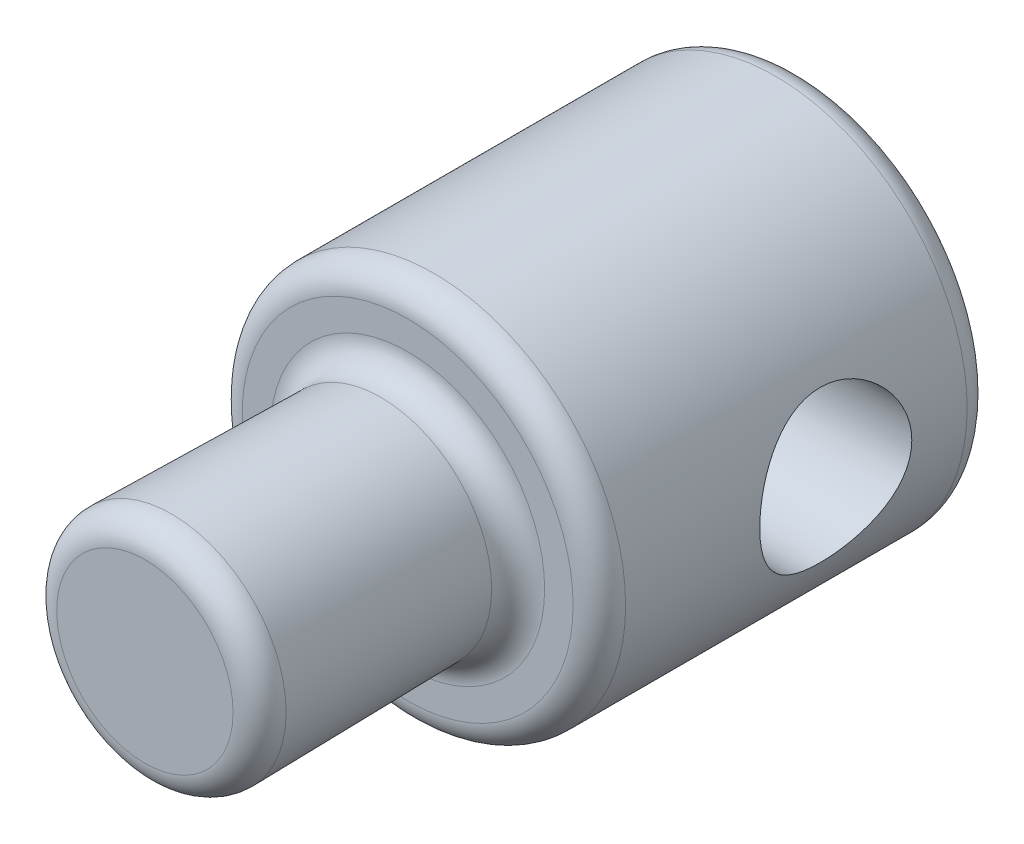
ISO-10303-21;
HEADER;
FILE_DESCRIPTION(('STEP AP214'),'2;1');
FILE_NAME('part.step','',(''),(''),'','','');
FILE_SCHEMA(('AUTOMOTIVE_DESIGN { 1 0 10303 214 1 1 1 1 }'));
ENDSEC;
DATA;
#1=APPLICATION_CONTEXT('core data for automotive mechanical design processes');
#2=APPLICATION_PROTOCOL_DEFINITION('international standard','automotive_design',2000,#1);
#3=PRODUCT_CONTEXT('',#1,'mechanical');
#4=PRODUCT('Part','Part','',(#3));
#5=PRODUCT_RELATED_PRODUCT_CATEGORY('part','',(#4));
#6=PRODUCT_DEFINITION_FORMATION('','',#4);
#7=PRODUCT_DEFINITION_CONTEXT('part definition',#1,'design');
#8=PRODUCT_DEFINITION('design','',#6,#7);
#9=PRODUCT_DEFINITION_SHAPE('','',#8);
#10=(LENGTH_UNIT() NAMED_UNIT(*) SI_UNIT(.MILLI.,.METRE.));
#11=(NAMED_UNIT(*) PLANE_ANGLE_UNIT() SI_UNIT($,.RADIAN.));
#12=(NAMED_UNIT(*) SI_UNIT($,.STERADIAN.) SOLID_ANGLE_UNIT());
#13=UNCERTAINTY_MEASURE_WITH_UNIT(LENGTH_MEASURE(1.E-05),#10,'distance_accuracy_value','');
#14=(GEOMETRIC_REPRESENTATION_CONTEXT(3) GLOBAL_UNCERTAINTY_ASSIGNED_CONTEXT((#13)) GLOBAL_UNIT_ASSIGNED_CONTEXT((#10,
#11,#12)) REPRESENTATION_CONTEXT('',''));
#15=CARTESIAN_POINT('',(0.,0.,0.));
#16=DIRECTION('',(0.,0.,1.));
#17=DIRECTION('',(1.,0.,0.));
#18=AXIS2_PLACEMENT_3D('',#15,#16,#17);
#19=CARTESIAN_POINT('',(0.,0.,7.5));
#20=DIRECTION('',(0.,0.,-1.));
#21=DIRECTION('',(-1.,0.,0.));
#22=AXIS2_PLACEMENT_3D('',#19,#20,#21);
#23=CYLINDRICAL_SURFACE('',#22,3.65);
#24=CARTESIAN_POINT('',(0.,0.,7.));
#25=DIRECTION('',(0.,0.,1.));
#26=DIRECTION('',(1.,0.,0.));
#27=AXIS2_PLACEMENT_3D('',#24,#25,#26);
#28=CIRCLE('',#27,3.65);
#29=CARTESIAN_POINT('',(3.65,0.,7.));
#30=VERTEX_POINT('',#29);
#31=EDGE_CURVE('E38',#30,#30,#28,.F.);
#32=ORIENTED_EDGE('',*,*,#31,.T.);
#33=EDGE_LOOP('',(#32));
#34=FACE_BOUND('',#33,.T.);
#35=CARTESIAN_POINT('',(0.,0.,0.5));
#36=DIRECTION('',(0.,0.,1.));
#37=DIRECTION('',(1.,0.,0.));
#38=AXIS2_PLACEMENT_3D('',#35,#36,#37);
#39=CIRCLE('',#38,3.65);
#40=CARTESIAN_POINT('',(3.65,0.,0.5));
#41=VERTEX_POINT('',#40);
#42=EDGE_CURVE('E42',#41,#41,#39,.T.);
#43=ORIENTED_EDGE('',*,*,#42,.T.);
#44=EDGE_LOOP('',(#43));
#45=FACE_BOUND('',#44,.T.);
#46=CARTESIAN_POINT('',(3.4907572028848,-1.06635554601099,2.02402985433312));
#47=CARTESIAN_POINT('',(3.47433340094243,-1.12011519832144,2.08298672949501));
#48=CARTESIAN_POINT('',(3.45801481899643,-1.16907814235958,2.14649641845138));
#49=CARTESIAN_POINT('',(3.42736564701972,-1.25610966903779,2.28119910217456));
#50=CARTESIAN_POINT('',(3.41303983698565,-1.29415228203152,2.35240986669365));
#51=CARTESIAN_POINT('',(3.38809444987374,-1.3581245585864,2.50091867779882));
#52=CARTESIAN_POINT('',(3.37748284665533,-1.38402820143571,2.57822938961605));
#53=CARTESIAN_POINT('',(3.36145110379116,-1.42253004445101,2.73655382971091));
#54=CARTESIAN_POINT('',(3.35602513933751,-1.43514317492284,2.81756329586792));
#55=CARTESIAN_POINT('',(3.35126796373,-1.44621407364177,2.97629185782361));
#56=CARTESIAN_POINT('',(3.3516220465919,-1.44540272934181,3.05395100576178));
#57=CARTESIAN_POINT('',(3.35761010164857,-1.43143650507849,3.20794518528418));
#58=CARTESIAN_POINT('',(3.36324457497591,-1.41828045354731,3.28428009049153));
#59=CARTESIAN_POINT('',(3.37885151826692,-1.38067309658902,3.43148064217386));
#60=CARTESIAN_POINT('',(3.38870740535699,-1.3565243251867,3.50243688246354));
#61=CARTESIAN_POINT('',(3.41160962506218,-1.29784721706682,3.63935923529652));
#62=CARTESIAN_POINT('',(3.42465679648061,-1.26331615089902,3.70532402990027));
#63=CARTESIAN_POINT('',(3.45348076853554,-1.18233913667038,3.83483941125098));
#64=CARTESIAN_POINT('',(3.46937709682455,-1.13528414638599,3.89798248736134));
#65=CARTESIAN_POINT('',(3.5015971256315,-1.03163033924307,4.01577749265487));
#66=CARTESIAN_POINT('',(3.51792098782301,-0.975027866631622,4.07042615384704));
#67=CARTESIAN_POINT('',(3.55022574819579,-0.850160544871231,4.17269777058331));
#68=CARTESIAN_POINT('',(3.56613901421401,-0.781427047463141,4.21977272570799));
#69=CARTESIAN_POINT('',(3.5948529394211,-0.636386143793492,4.3016142490277));
#70=CARTESIAN_POINT('',(3.60765435953009,-0.560080595517381,4.33638382712914));
#71=CARTESIAN_POINT('',(3.628339227933,-0.404493550753085,4.39143166620309));
#72=CARTESIAN_POINT('',(3.63636413363276,-0.325380082134694,4.41212964036373));
#73=CARTESIAN_POINT('',(3.64718311073424,-0.164456167353328,4.43985838466148));
#74=CARTESIAN_POINT('',(3.64997966558103,-0.0826470204280999,4.44689564364283));
#75=CARTESIAN_POINT('',(3.65001884385056,0.0757224128803292,4.44699187306782));
#76=CARTESIAN_POINT('',(3.64760534112423,0.152283659729818,4.44091631961156));
#77=CARTESIAN_POINT('',(3.63817139211249,0.303191250501697,4.41678038401657));
#78=CARTESIAN_POINT('',(3.63115098646814,0.377537613957238,4.39872010760433));
#79=CARTESIAN_POINT('',(3.61325258208363,0.521693714219351,4.35140378758723));
#80=CARTESIAN_POINT('',(3.60239165945356,0.591521939930665,4.32219725877983));
#81=CARTESIAN_POINT('',(3.57784177966545,0.72538647127878,4.25351822450502));
#82=CARTESIAN_POINT('',(3.56415205977742,0.78942120810496,4.21404294952586));
#83=CARTESIAN_POINT('',(3.5343289243536,0.91398174932301,4.1232351588767));
#84=CARTESIAN_POINT('',(3.51809855434694,0.974071805197713,4.07133671732291));
#85=CARTESIAN_POINT('',(3.48549544344382,1.08497436234468,3.95843434733939));
#86=CARTESIAN_POINT('',(3.46912264542195,1.13578294248014,3.89742659019474));
#87=CARTESIAN_POINT('',(3.43722516324893,1.22903531133008,3.76461519035351));
#88=CARTESIAN_POINT('',(3.42177529278563,1.27098041823795,3.6924415085164));
#89=CARTESIAN_POINT('',(3.39453948244694,1.3420356322372,3.54139017282783));
#90=CARTESIAN_POINT('',(3.38275205122531,1.37115096564101,3.46251526442285));
#91=CARTESIAN_POINT('',(3.3648485185758,1.41450640095995,3.30354776652904));
#92=CARTESIAN_POINT('',(3.35852574383977,1.42929142534295,3.22362799026034));
#93=CARTESIAN_POINT('',(3.35168003316212,1.44527609410235,3.06221159503834));
#94=CARTESIAN_POINT('',(3.35115420826222,1.44648250550002,2.98071578180404));
#95=CARTESIAN_POINT('',(3.35580233491057,1.43565824922411,2.8244165377329));
#96=CARTESIAN_POINT('',(3.36058873045905,1.42452770514062,2.74953675092833));
#97=CARTESIAN_POINT('',(3.37464253547267,1.39090473253634,2.60281775034706));
#98=CARTESIAN_POINT('',(3.3839106505487,1.36841051487109,2.53097901729753));
#99=CARTESIAN_POINT('',(3.40603026037464,1.3123920622994,2.39098460006442));
#100=CARTESIAN_POINT('',(3.41893691726632,1.27869647603227,2.32290660098599));
#101=CARTESIAN_POINT('',(3.44687762922807,1.20134195324479,2.19314608898578));
#102=CARTESIAN_POINT('',(3.46191245319014,1.15767941222431,2.1314659015667));
#103=CARTESIAN_POINT('',(3.49377637338656,1.0578129075108,2.01142636629943));
#104=CARTESIAN_POINT('',(3.51065581975265,1.00091864205516,1.95365325742299));
#105=CARTESIAN_POINT('',(3.54337193594542,0.878095040812412,1.84828064760304));
#106=CARTESIAN_POINT('',(3.55920839128246,0.812163855131736,1.80068323478471));
#107=CARTESIAN_POINT('',(3.58846309248547,0.671343538370003,1.71614893974568));
#108=CARTESIAN_POINT('',(3.60182484678852,0.596297941445842,1.67945168240272));
#109=CARTESIAN_POINT('',(3.62418309828771,0.440432106778736,1.61942629405831));
#110=CARTESIAN_POINT('',(3.63318168990785,0.359614661081171,1.59609174765539));
#111=CARTESIAN_POINT('',(3.64537493391949,0.199524047084137,1.56473397574841));
#112=CARTESIAN_POINT('',(3.64887556384869,0.120432556610964,1.55590219640449));
#113=CARTESIAN_POINT('',(3.65066086466114,-0.0381651024981441,1.55138024231981));
#114=CARTESIAN_POINT('',(3.64894756476715,-0.117671097788068,1.55568495495574));
#115=CARTESIAN_POINT('',(3.64070139341126,-0.270955315364573,1.57672616608268));
#116=CARTESIAN_POINT('',(3.63439642265662,-0.3448279384368,1.59287505689879));
#117=CARTESIAN_POINT('',(3.61785038715681,-0.488788409308138,1.63633476346819));
#118=CARTESIAN_POINT('',(3.60760663317729,-0.55887363386224,1.66365320612742));
#119=CARTESIAN_POINT('',(3.58381253742255,-0.69551652910994,1.72950325437396));
#120=CARTESIAN_POINT('',(3.57017433937684,-0.761911330426762,1.76833912696888));
#121=CARTESIAN_POINT('',(3.54108082177924,-0.887346095295939,1.85573461403239));
#122=CARTESIAN_POINT('',(3.52562919015779,-0.946400499666926,1.90427463024126));
#123=CARTESIAN_POINT('',(3.50360186690154,-1.0236322998338,1.97867313504468));
#124=CARTESIAN_POINT('',(3.49717151034782,-1.04535974124945,2.00100427684051));
#125=CARTESIAN_POINT('',(3.4907572028848,-1.06635554601099,2.02402985433312));
#126=B_SPLINE_CURVE_WITH_KNOTS('',3,(#46,#47,#48,#49,#50,#51,#52,#53,#54,#55,#56,#57,#58,#59,
#60,#61,#62,#63,#64,#65,#66,#67,#68,#69,#70,#71,#72,#73,#74,#75,#76,#77,#78,#79,#80,#81,#82,#83,
#84,#85,#86,#87,#88,#89,#90,#91,#92,#93,#94,#95,#96,#97,#98,#99,#100,#101,#102,#103,#104,#105,
#106,#107,#108,#109,#110,#111,#112,#113,#114,#115,#116,#117,#118,#119,#120,#121,#122,#123,#124,
#125),.UNSPECIFIED.,.T.,.F.,(4,2,2,2,2,2,2,2,2,2,2,2,2,2,2,2,2,2,2,2,2,2,2,2,2,2,2,2,2,2,2,2,2,
2,2,2,2,2,2,4),(0.,0.244295087722937,0.489166409913373,0.734560256253544,0.979678137008933,
1.21149683372462,1.44333753329473,1.66915107270126,1.89502402927471,2.13499173387641,
2.37505153211667,2.62824593515989,2.88137836374941,3.12658366959702,3.37167247431544,
3.60108140062012,3.83048830315838,4.05888775945547,4.28734887975539,4.52940893878002,
4.77157102538765,5.02499102477413,5.27830769581731,5.52156236844414,5.76469580759367,
5.99119237898028,6.21772462205673,6.4478952163218,6.67814918289523,6.92549249294211,
7.1728865109786,7.42537330781033,7.67773878456682,7.91548718981428,8.15314307698308,
8.37974385819829,8.60649962833985,8.83987986050041,9.07279344009862,9.16820276187801),.UNSPECIFIED.);
#127=CARTESIAN_POINT('',(3.4907572028848,-1.06635554601099,2.02402985433312));
#128=VERTEX_POINT('',#127);
#129=EDGE_CURVE('E63',#128,#128,#126,.T.);
#130=ORIENTED_EDGE('',*,*,#129,.T.);
#131=EDGE_LOOP('',(#130));
#132=FACE_BOUND('',#131,.T.);
#133=ADVANCED_FACE('F31',(#34,#45,#132),#23,.T.);
#134=CARTESIAN_POINT('',(0.,0.,7.5));
#135=DIRECTION('',(0.,0.,1.));
#136=DIRECTION('',(1.,0.,0.));
#137=AXIS2_PLACEMENT_3D('',#134,#135,#136);
#138=PLANE('',#137);
#139=CARTESIAN_POINT('',(0.,0.,7.5));
#140=DIRECTION('',(0.,0.,1.));
#141=DIRECTION('',(1.,0.,0.));
#142=AXIS2_PLACEMENT_3D('',#139,#140,#141);
#143=CIRCLE('',#142,3.15);
#144=CARTESIAN_POINT('',(3.15,0.,7.5));
#145=VERTEX_POINT('',#144);
#146=EDGE_CURVE('E46',#145,#145,#143,.T.);
#147=ORIENTED_EDGE('',*,*,#146,.T.);
#148=EDGE_LOOP('',(#147));
#149=FACE_BOUND('',#148,.T.);
#150=CARTESIAN_POINT('',(0.,0.,7.5));
#151=DIRECTION('',(0.,0.,1.));
#152=DIRECTION('',(1.,0.,0.));
#153=AXIS2_PLACEMENT_3D('',#150,#151,#152);
#154=CIRCLE('',#153,2.60880369648606);
#155=CARTESIAN_POINT('',(2.60880369648606,0.,7.5));
#156=VERTEX_POINT('',#155);
#157=EDGE_CURVE('E51',#156,#156,#154,.F.);
#158=ORIENTED_EDGE('',*,*,#157,.T.);
#159=EDGE_LOOP('',(#158));
#160=FACE_BOUND('',#159,.T.);
#161=ADVANCED_FACE('F83',(#149,#160),#138,.T.);
#162=CARTESIAN_POINT('',(0.,0.,0.));
#163=DIRECTION('',(0.,0.,1.));
#164=DIRECTION('',(1.,0.,0.));
#165=AXIS2_PLACEMENT_3D('',#162,#163,#164);
#166=PLANE('',#165);
#167=CARTESIAN_POINT('',(0.,0.,0.));
#168=DIRECTION('',(0.,0.,1.));
#169=DIRECTION('',(1.,0.,0.));
#170=AXIS2_PLACEMENT_3D('',#167,#168,#169);
#171=CIRCLE('',#170,3.15);
#172=CARTESIAN_POINT('',(3.15,0.,0.));
#173=VERTEX_POINT('',#172);
#174=EDGE_CURVE('E10',#173,#173,#171,.F.);
#175=ORIENTED_EDGE('',*,*,#174,.T.);
#176=EDGE_LOOP('',(#175));
#177=FACE_BOUND('',#176,.T.);
#178=ADVANCED_FACE('F80',(#177),#166,.F.);
#179=CARTESIAN_POINT('',(4.,0.,3.));
#180=DIRECTION('',(1.,0.,0.));
#181=DIRECTION('',(0.,0.,-1.));
#182=AXIS2_PLACEMENT_3D('',#179,#180,#181);
#183=CONICAL_SURFACE('',#182,1.45,0.00872664625997167);
#184=CARTESIAN_POINT('',(-3.2,0.,3.));
#185=DIRECTION('',(1.,0.,0.));
#186=DIRECTION('',(0.,0.,-1.));
#187=AXIS2_PLACEMENT_3D('',#184,#185,#186);
#188=CIRCLE('',#187,1.38716655190654);
#189=CARTESIAN_POINT('',(-3.2,0.,1.61283344809346));
#190=VERTEX_POINT('',#189);
#191=EDGE_CURVE('E70',#190,#190,#188,.T.);
#192=ORIENTED_EDGE('',*,*,#191,.F.);
#193=EDGE_LOOP('',(#192));
#194=FACE_BOUND('',#193,.T.);
#195=ORIENTED_EDGE('',*,*,#129,.F.);
#196=EDGE_LOOP('',(#195));
#197=FACE_BOUND('',#196,.T.);
#198=ADVANCED_FACE('F74',(#194,#197),#183,.F.);
#199=CARTESIAN_POINT('',(-3.2,0.,3.));
#200=DIRECTION('',(1.,0.,0.));
#201=DIRECTION('',(0.,0.,-1.));
#202=AXIS2_PLACEMENT_3D('',#199,#200,#201);
#203=PLANE('',#202);
#204=ORIENTED_EDGE('',*,*,#191,.T.);
#205=EDGE_LOOP('',(#204));
#206=FACE_BOUND('',#205,.T.);
#207=ADVANCED_FACE('F79',(#206),#203,.T.);
#208=CARTESIAN_POINT('',(0.,0.,7.5));
#209=DIRECTION('',(0.,0.,1.));
#210=DIRECTION('',(1.,0.,0.));
#211=AXIS2_PLACEMENT_3D('',#208,#209,#210);
#212=CONICAL_SURFACE('',#211,2.1,0.0174532925199433);
#213=CARTESIAN_POINT('',(0.,0.,11.9912737967814));
#214=DIRECTION('',(0.,0.,1.));
#215=DIRECTION('',(1.,0.,0.));
#216=AXIS2_PLACEMENT_3D('',#213,#214,#215);
#217=CIRCLE('',#216,2.17839547573322);
#218=CARTESIAN_POINT('',(2.17839547573322,0.,11.9912737967814));
#219=VERTEX_POINT('',#218);
#220=EDGE_CURVE('E54',#219,#219,#217,.F.);
#221=ORIENTED_EDGE('',*,*,#220,.T.);
#222=EDGE_LOOP('',(#221));
#223=FACE_BOUND('',#222,.T.);
#224=CARTESIAN_POINT('',(0.,0.,8.00872620321866));
#225=DIRECTION('',(0.,0.,-1.));
#226=DIRECTION('',(-1.,0.,0.));
#227=AXIS2_PLACEMENT_3D('',#224,#225,#226);
#228=CIRCLE('',#227,2.10887984890787);
#229=CARTESIAN_POINT('',(-2.10887984890787,0.,8.00872620321866));
#230=VERTEX_POINT('',#229);
#231=EDGE_CURVE('E57',#230,#230,#228,.F.);
#232=ORIENTED_EDGE('',*,*,#231,.T.);
#233=EDGE_LOOP('',(#232));
#234=FACE_BOUND('',#233,.T.);
#235=ADVANCED_FACE('F116',(#223,#234),#212,.T.);
#236=CARTESIAN_POINT('',(0.,0.,12.5));
#237=DIRECTION('',(0.,0.,1.));
#238=DIRECTION('',(1.,0.,0.));
#239=AXIS2_PLACEMENT_3D('',#236,#237,#238);
#240=PLANE('',#239);
#241=CARTESIAN_POINT('',(0.,0.,12.5));
#242=DIRECTION('',(0.,0.,1.));
#243=DIRECTION('',(1.,0.,0.));
#244=AXIS2_PLACEMENT_3D('',#241,#242,#243);
#245=CIRCLE('',#244,1.67847162815503);
#246=CARTESIAN_POINT('',(1.67847162815503,0.,12.5));
#247=VERTEX_POINT('',#246);
#248=EDGE_CURVE('E60',#247,#247,#245,.T.);
#249=ORIENTED_EDGE('',*,*,#248,.T.);
#250=EDGE_LOOP('',(#249));
#251=FACE_BOUND('',#250,.T.);
#252=ADVANCED_FACE('F111',(#251),#240,.T.);
#253=CARTESIAN_POINT('',(0.,0.,12.));
#254=DIRECTION('',(0.,0.,1.));
#255=DIRECTION('',(1.,0.,0.));
#256=AXIS2_PLACEMENT_3D('',#253,#254,#255);
#257=TOROIDAL_SURFACE('',#256,1.67847162815503,0.5);
#258=ORIENTED_EDGE('',*,*,#220,.F.);
#259=EDGE_LOOP('',(#258));
#260=FACE_BOUND('',#259,.T.);
#261=ORIENTED_EDGE('',*,*,#248,.F.);
#262=EDGE_LOOP('',(#261));
#263=FACE_BOUND('',#262,.T.);
#264=ADVANCED_FACE('F107',(#260,#263),#257,.T.);
#265=CARTESIAN_POINT('',(0.,0.,7.));
#266=DIRECTION('',(0.,0.,1.));
#267=DIRECTION('',(1.,0.,0.));
#268=AXIS2_PLACEMENT_3D('',#265,#266,#267);
#269=TOROIDAL_SURFACE('',#268,3.15,0.5);
#270=ORIENTED_EDGE('',*,*,#31,.F.);
#271=EDGE_LOOP('',(#270));
#272=FACE_BOUND('',#271,.T.);
#273=ORIENTED_EDGE('',*,*,#146,.F.);
#274=EDGE_LOOP('',(#273));
#275=FACE_BOUND('',#274,.T.);
#276=ADVANCED_FACE('F100',(#272,#275),#269,.T.);
#277=CARTESIAN_POINT('',(0.,0.,0.5));
#278=DIRECTION('',(0.,0.,1.));
#279=DIRECTION('',(1.,0.,0.));
#280=AXIS2_PLACEMENT_3D('',#277,#278,#279);
#281=TOROIDAL_SURFACE('',#280,3.15,0.5);
#282=ORIENTED_EDGE('',*,*,#174,.F.);
#283=EDGE_LOOP('',(#282));
#284=FACE_BOUND('',#283,.T.);
#285=ORIENTED_EDGE('',*,*,#42,.F.);
#286=EDGE_LOOP('',(#285));
#287=FACE_BOUND('',#286,.T.);
#288=ADVANCED_FACE('F98',(#284,#287),#281,.T.);
#289=CARTESIAN_POINT('',(0.,0.,8.));
#290=DIRECTION('',(0.,0.,1.));
#291=DIRECTION('',(1.,0.,0.));
#292=AXIS2_PLACEMENT_3D('',#289,#290,#291);
#293=TOROIDAL_SURFACE('',#292,2.60880369648606,0.5);
#294=ORIENTED_EDGE('',*,*,#157,.F.);
#295=EDGE_LOOP('',(#294));
#296=FACE_BOUND('',#295,.T.);
#297=ORIENTED_EDGE('',*,*,#231,.F.);
#298=EDGE_LOOP('',(#297));
#299=FACE_BOUND('',#298,.T.);
#300=ADVANCED_FACE('F33',(#296,#299),#293,.F.);
#301=CLOSED_SHELL('',(#133,#161,#178,#198,#207,#235,#252,#264,#276,#288,#300));
#302=MANIFOLD_SOLID_BREP('B2',#301);
#303=ADVANCED_BREP_SHAPE_REPRESENTATION('',(#18,#302),#14);
#304=SHAPE_DEFINITION_REPRESENTATION(#9,#303);
ENDSEC;
END-ISO-10303-21;
